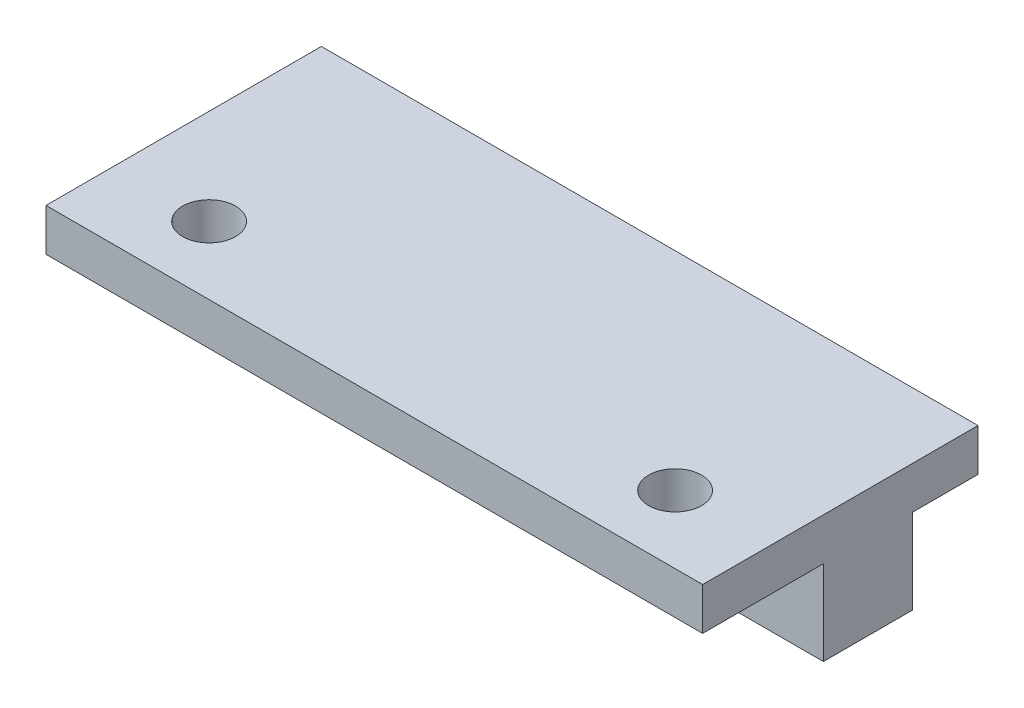
ISO-10303-21;
HEADER;
FILE_DESCRIPTION(('STEP AP214'),'2;1');
FILE_NAME('part.step','',(''),(''),'','','');
FILE_SCHEMA(('AUTOMOTIVE_DESIGN { 1 0 10303 214 1 1 1 1 }'));
ENDSEC;
DATA;
#1=APPLICATION_CONTEXT('core data for automotive mechanical design processes');
#2=APPLICATION_PROTOCOL_DEFINITION('international standard','automotive_design',2000,#1);
#3=PRODUCT_CONTEXT('',#1,'mechanical');
#4=PRODUCT('Part','Part','',(#3));
#5=PRODUCT_RELATED_PRODUCT_CATEGORY('part','',(#4));
#6=PRODUCT_DEFINITION_FORMATION('','',#4);
#7=PRODUCT_DEFINITION_CONTEXT('part definition',#1,'design');
#8=PRODUCT_DEFINITION('design','',#6,#7);
#9=PRODUCT_DEFINITION_SHAPE('','',#8);
#10=(LENGTH_UNIT() NAMED_UNIT(*) SI_UNIT(.MILLI.,.METRE.));
#11=(NAMED_UNIT(*) PLANE_ANGLE_UNIT() SI_UNIT($,.RADIAN.));
#12=(NAMED_UNIT(*) SI_UNIT($,.STERADIAN.) SOLID_ANGLE_UNIT());
#13=UNCERTAINTY_MEASURE_WITH_UNIT(LENGTH_MEASURE(1.E-05),#10,'distance_accuracy_value','');
#14=(GEOMETRIC_REPRESENTATION_CONTEXT(3) GLOBAL_UNCERTAINTY_ASSIGNED_CONTEXT((#13)) GLOBAL_UNIT_ASSIGNED_CONTEXT((#10,
#11,#12)) REPRESENTATION_CONTEXT('',''));
#15=CARTESIAN_POINT('',(0.,0.,0.));
#16=DIRECTION('',(0.,0.,1.));
#17=DIRECTION('',(1.,0.,0.));
#18=AXIS2_PLACEMENT_3D('',#15,#16,#17);
#19=CARTESIAN_POINT('',(0.,0.,0.));
#20=DIRECTION('',(0.,-1.,0.));
#21=DIRECTION('',(0.,0.,-1.));
#22=AXIS2_PLACEMENT_3D('',#19,#20,#21);
#23=PLANE('',#22);
#24=DIRECTION('',(-1.,0.,0.));
#25=VECTOR('',#24,1.);
#26=CARTESIAN_POINT('',(0.,0.,-5.7));
#27=LINE('',#26,#25);
#28=CARTESIAN_POINT('',(31.,0.,-5.7));
#29=VERTEX_POINT('',#28);
#30=CARTESIAN_POINT('',(0.,0.,-5.7));
#31=VERTEX_POINT('',#30);
#32=EDGE_CURVE('E61',#29,#31,#27,.T.);
#33=ORIENTED_EDGE('',*,*,#32,.F.);
#34=DIRECTION('',(0.,0.,-1.));
#35=VECTOR('',#34,1.);
#36=CARTESIAN_POINT('',(31.,0.,0.));
#37=LINE('',#36,#35);
#38=CARTESIAN_POINT('',(31.,0.,0.));
#39=VERTEX_POINT('',#38);
#40=EDGE_CURVE('E223',#39,#29,#37,.T.);
#41=ORIENTED_EDGE('',*,*,#40,.F.);
#42=DIRECTION('',(1.,0.,0.));
#43=VECTOR('',#42,1.);
#44=CARTESIAN_POINT('',(0.,0.,0.));
#45=LINE('',#44,#43);
#46=CARTESIAN_POINT('',(0.,0.,0.));
#47=VERTEX_POINT('',#46);
#48=EDGE_CURVE('E220',#47,#39,#45,.T.);
#49=ORIENTED_EDGE('',*,*,#48,.F.);
#50=DIRECTION('',(0.,0.,1.));
#51=VECTOR('',#50,1.);
#52=CARTESIAN_POINT('',(0.,0.,0.));
#53=LINE('',#52,#51);
#54=EDGE_CURVE('E203',#31,#47,#53,.T.);
#55=ORIENTED_EDGE('',*,*,#54,.F.);
#56=EDGE_LOOP('',(#33,#41,#49,#55));
#57=FACE_BOUND('',#56,.T.);
#58=CARTESIAN_POINT('',(4.5,0.,-3.2));
#59=DIRECTION('',(0.,1.,0.));
#60=DIRECTION('',(0.,0.,1.));
#61=AXIS2_PLACEMENT_3D('',#58,#59,#60);
#62=CIRCLE('',#61,1.25);
#63=CARTESIAN_POINT('',(4.5,0.,-1.95));
#64=VERTEX_POINT('',#63);
#65=EDGE_CURVE('E197',#64,#64,#62,.T.);
#66=ORIENTED_EDGE('',*,*,#65,.T.);
#67=EDGE_LOOP('',(#66));
#68=FACE_BOUND('',#67,.T.);
#69=CARTESIAN_POINT('',(26.5,0.,-3.2));
#70=DIRECTION('',(0.,1.,0.));
#71=DIRECTION('',(0.,0.,-1.));
#72=AXIS2_PLACEMENT_3D('',#69,#70,#71);
#73=CIRCLE('',#72,1.25);
#74=CARTESIAN_POINT('',(26.5,0.,-4.45));
#75=VERTEX_POINT('',#74);
#76=EDGE_CURVE('E193',#75,#75,#73,.T.);
#77=ORIENTED_EDGE('',*,*,#76,.T.);
#78=EDGE_LOOP('',(#77));
#79=FACE_BOUND('',#78,.T.);
#80=ADVANCED_FACE('F38',(#57,#68,#79),#23,.T.);
#81=CARTESIAN_POINT('',(0.,2.,0.));
#82=DIRECTION('',(0.,-1.,0.));
#83=DIRECTION('',(0.,0.,-1.));
#84=AXIS2_PLACEMENT_3D('',#81,#82,#83);
#85=PLANE('',#84);
#86=DIRECTION('',(0.,0.,1.));
#87=VECTOR('',#86,1.);
#88=CARTESIAN_POINT('',(0.,2.,0.));
#89=LINE('',#88,#87);
#90=CARTESIAN_POINT('',(0.,2.,-13.));
#91=VERTEX_POINT('',#90);
#92=CARTESIAN_POINT('',(0.,2.,0.));
#93=VERTEX_POINT('',#92);
#94=EDGE_CURVE('E206',#91,#93,#89,.T.);
#95=ORIENTED_EDGE('',*,*,#94,.T.);
#96=DIRECTION('',(1.,0.,0.));
#97=VECTOR('',#96,1.);
#98=CARTESIAN_POINT('',(0.,2.,0.));
#99=LINE('',#98,#97);
#100=CARTESIAN_POINT('',(31.,2.,0.));
#101=VERTEX_POINT('',#100);
#102=EDGE_CURVE('E209',#93,#101,#99,.T.);
#103=ORIENTED_EDGE('',*,*,#102,.T.);
#104=DIRECTION('',(0.,0.,-1.));
#105=VECTOR('',#104,1.);
#106=CARTESIAN_POINT('',(31.,2.,0.));
#107=LINE('',#106,#105);
#108=CARTESIAN_POINT('',(31.,2.,-13.));
#109=VERTEX_POINT('',#108);
#110=EDGE_CURVE('E212',#101,#109,#107,.T.);
#111=ORIENTED_EDGE('',*,*,#110,.T.);
#112=DIRECTION('',(-1.,0.,0.));
#113=VECTOR('',#112,1.);
#114=CARTESIAN_POINT('',(0.,2.,-13.));
#115=LINE('',#114,#113);
#116=EDGE_CURVE('E214',#109,#91,#115,.T.);
#117=ORIENTED_EDGE('',*,*,#116,.T.);
#118=EDGE_LOOP('',(#95,#103,#111,#117));
#119=FACE_BOUND('',#118,.T.);
#120=CARTESIAN_POINT('',(4.5,2.,-3.2));
#121=DIRECTION('',(0.,1.,0.));
#122=DIRECTION('',(0.,0.,1.));
#123=AXIS2_PLACEMENT_3D('',#120,#121,#122);
#124=CIRCLE('',#123,1.25);
#125=CARTESIAN_POINT('',(4.5,2.,-1.95));
#126=VERTEX_POINT('',#125);
#127=EDGE_CURVE('E200',#126,#126,#124,.T.);
#128=ORIENTED_EDGE('',*,*,#127,.F.);
#129=EDGE_LOOP('',(#128));
#130=FACE_BOUND('',#129,.T.);
#131=CARTESIAN_POINT('',(26.5,2.,-3.2));
#132=DIRECTION('',(0.,1.,0.));
#133=DIRECTION('',(0.,0.,-1.));
#134=AXIS2_PLACEMENT_3D('',#131,#132,#133);
#135=CIRCLE('',#134,1.25);
#136=CARTESIAN_POINT('',(26.5,2.,-4.45));
#137=VERTEX_POINT('',#136);
#138=EDGE_CURVE('E194',#137,#137,#135,.T.);
#139=ORIENTED_EDGE('',*,*,#138,.F.);
#140=EDGE_LOOP('',(#139));
#141=FACE_BOUND('',#140,.T.);
#142=ADVANCED_FACE('F264',(#119,#130,#141),#85,.F.);
#143=DIRECTION('',(1.,0.,0.));
#144=VECTOR('',#143,1.);
#145=CARTESIAN_POINT('',(0.,0.,-9.9));
#146=LINE('',#145,#144);
#147=CARTESIAN_POINT('',(0.,0.,-9.9));
#148=VERTEX_POINT('',#147);
#149=CARTESIAN_POINT('',(31.,0.,-9.9));
#150=VERTEX_POINT('',#149);
#151=EDGE_CURVE('E145',#148,#150,#146,.T.);
#152=ORIENTED_EDGE('',*,*,#151,.F.);
#153=CARTESIAN_POINT('',(0.,0.,-13.));
#154=VERTEX_POINT('',#153);
#155=EDGE_CURVE('E217',#154,#148,#53,.T.);
#156=ORIENTED_EDGE('',*,*,#155,.F.);
#157=DIRECTION('',(-1.,0.,0.));
#158=VECTOR('',#157,1.);
#159=CARTESIAN_POINT('',(0.,0.,-13.));
#160=LINE('',#159,#158);
#161=CARTESIAN_POINT('',(31.,0.,-13.));
#162=VERTEX_POINT('',#161);
#163=EDGE_CURVE('E210',#162,#154,#160,.T.);
#164=ORIENTED_EDGE('',*,*,#163,.F.);
#165=EDGE_CURVE('E222',#150,#162,#37,.T.);
#166=ORIENTED_EDGE('',*,*,#165,.F.);
#167=EDGE_LOOP('',(#152,#156,#164,#166));
#168=FACE_BOUND('',#167,.T.);
#169=ADVANCED_FACE('F257',(#168),#23,.T.);
#170=CARTESIAN_POINT('',(0.,2.,0.));
#171=DIRECTION('',(1.,0.,0.));
#172=DIRECTION('',(0.,0.,-1.));
#173=AXIS2_PLACEMENT_3D('',#170,#171,#172);
#174=PLANE('',#173);
#175=ORIENTED_EDGE('',*,*,#155,.T.);
#176=DIRECTION('',(0.,1.,0.));
#177=VECTOR('',#176,1.);
#178=CARTESIAN_POINT('',(0.,-4.,-9.9));
#179=LINE('',#178,#177);
#180=CARTESIAN_POINT('',(0.,-4.,-9.9));
#181=VERTEX_POINT('',#180);
#182=EDGE_CURVE('E190',#181,#148,#179,.T.);
#183=ORIENTED_EDGE('',*,*,#182,.F.);
#184=DIRECTION('',(0.,0.,-1.));
#185=VECTOR('',#184,1.);
#186=CARTESIAN_POINT('',(0.,-4.,-5.7));
#187=LINE('',#186,#185);
#188=CARTESIAN_POINT('',(0.,-4.,-5.7));
#189=VERTEX_POINT('',#188);
#190=EDGE_CURVE('E169',#189,#181,#187,.T.);
#191=ORIENTED_EDGE('',*,*,#190,.F.);
#192=DIRECTION('',(0.,1.,0.));
#193=VECTOR('',#192,1.);
#194=CARTESIAN_POINT('',(0.,-4.,-5.7));
#195=LINE('',#194,#193);
#196=EDGE_CURVE('E178',#189,#31,#195,.T.);
#197=ORIENTED_EDGE('',*,*,#196,.T.);
#198=ORIENTED_EDGE('',*,*,#54,.T.);
#199=DIRECTION('',(0.,-1.,0.));
#200=VECTOR('',#199,1.);
#201=CARTESIAN_POINT('',(0.,2.,0.));
#202=LINE('',#201,#200);
#203=EDGE_CURVE('E11',#93,#47,#202,.T.);
#204=ORIENTED_EDGE('',*,*,#203,.F.);
#205=ORIENTED_EDGE('',*,*,#94,.F.);
#206=DIRECTION('',(0.,-1.,0.));
#207=VECTOR('',#206,1.);
#208=CARTESIAN_POINT('',(0.,2.,-13.));
#209=LINE('',#208,#207);
#210=EDGE_CURVE('E216',#91,#154,#209,.T.);
#211=ORIENTED_EDGE('',*,*,#210,.T.);
#212=EDGE_LOOP('',(#175,#183,#191,#197,#198,#204,#205,#211));
#213=FACE_BOUND('',#212,.T.);
#214=ADVANCED_FACE('F40',(#213),#174,.F.);
#215=CARTESIAN_POINT('',(0.,2.,0.));
#216=DIRECTION('',(0.,0.,-1.));
#217=DIRECTION('',(-1.,0.,0.));
#218=AXIS2_PLACEMENT_3D('',#215,#216,#217);
#219=PLANE('',#218);
#220=ORIENTED_EDGE('',*,*,#48,.T.);
#221=DIRECTION('',(0.,-1.,0.));
#222=VECTOR('',#221,1.);
#223=CARTESIAN_POINT('',(31.,2.,0.));
#224=LINE('',#223,#222);
#225=EDGE_CURVE('E46',#101,#39,#224,.T.);
#226=ORIENTED_EDGE('',*,*,#225,.F.);
#227=ORIENTED_EDGE('',*,*,#102,.F.);
#228=ORIENTED_EDGE('',*,*,#203,.T.);
#229=EDGE_LOOP('',(#220,#226,#227,#228));
#230=FACE_BOUND('',#229,.T.);
#231=ADVANCED_FACE('F241',(#230),#219,.F.);
#232=CARTESIAN_POINT('',(31.,2.,0.));
#233=DIRECTION('',(-1.,0.,0.));
#234=DIRECTION('',(0.,0.,1.));
#235=AXIS2_PLACEMENT_3D('',#232,#233,#234);
#236=PLANE('',#235);
#237=ORIENTED_EDGE('',*,*,#40,.T.);
#238=DIRECTION('',(0.,1.,0.));
#239=VECTOR('',#238,1.);
#240=CARTESIAN_POINT('',(31.,-4.,-5.7));
#241=LINE('',#240,#239);
#242=CARTESIAN_POINT('',(31.,-4.,-5.7));
#243=VERTEX_POINT('',#242);
#244=EDGE_CURVE('E184',#243,#29,#241,.T.);
#245=ORIENTED_EDGE('',*,*,#244,.F.);
#246=DIRECTION('',(0.,0.,1.));
#247=VECTOR('',#246,1.);
#248=CARTESIAN_POINT('',(31.,-4.,-5.7));
#249=LINE('',#248,#247);
#250=CARTESIAN_POINT('',(31.,-4.,-9.9));
#251=VERTEX_POINT('',#250);
#252=EDGE_CURVE('E174',#251,#243,#249,.T.);
#253=ORIENTED_EDGE('',*,*,#252,.F.);
#254=DIRECTION('',(0.,1.,0.));
#255=VECTOR('',#254,1.);
#256=CARTESIAN_POINT('',(31.,-4.,-9.9));
#257=LINE('',#256,#255);
#258=EDGE_CURVE('E187',#251,#150,#257,.T.);
#259=ORIENTED_EDGE('',*,*,#258,.T.);
#260=ORIENTED_EDGE('',*,*,#165,.T.);
#261=DIRECTION('',(0.,-1.,0.));
#262=VECTOR('',#261,1.);
#263=CARTESIAN_POINT('',(31.,2.,-13.));
#264=LINE('',#263,#262);
#265=EDGE_CURVE('E228',#109,#162,#264,.T.);
#266=ORIENTED_EDGE('',*,*,#265,.F.);
#267=ORIENTED_EDGE('',*,*,#110,.F.);
#268=ORIENTED_EDGE('',*,*,#225,.T.);
#269=EDGE_LOOP('',(#237,#245,#253,#259,#260,#266,#267,#268));
#270=FACE_BOUND('',#269,.T.);
#271=ADVANCED_FACE('F234',(#270),#236,.F.);
#272=CARTESIAN_POINT('',(0.,2.,-13.));
#273=DIRECTION('',(0.,0.,1.));
#274=DIRECTION('',(1.,0.,0.));
#275=AXIS2_PLACEMENT_3D('',#272,#273,#274);
#276=PLANE('',#275);
#277=ORIENTED_EDGE('',*,*,#163,.T.);
#278=ORIENTED_EDGE('',*,*,#210,.F.);
#279=ORIENTED_EDGE('',*,*,#116,.F.);
#280=ORIENTED_EDGE('',*,*,#265,.T.);
#281=EDGE_LOOP('',(#277,#278,#279,#280));
#282=FACE_BOUND('',#281,.T.);
#283=ADVANCED_FACE('F262',(#282),#276,.F.);
#284=CARTESIAN_POINT('',(4.5,2.,-3.2));
#285=DIRECTION('',(0.,-1.,0.));
#286=DIRECTION('',(0.,0.,-1.));
#287=AXIS2_PLACEMENT_3D('',#284,#285,#286);
#288=CYLINDRICAL_SURFACE('',#287,1.25);
#289=ORIENTED_EDGE('',*,*,#127,.T.);
#290=EDGE_LOOP('',(#289));
#291=FACE_BOUND('',#290,.T.);
#292=ORIENTED_EDGE('',*,*,#65,.F.);
#293=EDGE_LOOP('',(#292));
#294=FACE_BOUND('',#293,.T.);
#295=ADVANCED_FACE('F275',(#291,#294),#288,.F.);
#296=CARTESIAN_POINT('',(26.5,2.,-3.2));
#297=DIRECTION('',(0.,-1.,0.));
#298=DIRECTION('',(0.,0.,-1.));
#299=AXIS2_PLACEMENT_3D('',#296,#297,#298);
#300=CYLINDRICAL_SURFACE('',#299,1.25);
#301=ORIENTED_EDGE('',*,*,#138,.T.);
#302=EDGE_LOOP('',(#301));
#303=FACE_BOUND('',#302,.T.);
#304=ORIENTED_EDGE('',*,*,#76,.F.);
#305=EDGE_LOOP('',(#304));
#306=FACE_BOUND('',#305,.T.);
#307=ADVANCED_FACE('F272',(#303,#306),#300,.F.);
#308=CARTESIAN_POINT('',(0.,-4.,0.));
#309=DIRECTION('',(0.,-1.,0.));
#310=DIRECTION('',(0.,0.,-1.));
#311=AXIS2_PLACEMENT_3D('',#308,#309,#310);
#312=PLANE('',#311);
#313=ORIENTED_EDGE('',*,*,#190,.T.);
#314=DIRECTION('',(1.,0.,0.));
#315=VECTOR('',#314,1.);
#316=CARTESIAN_POINT('',(0.,-4.,-9.9));
#317=LINE('',#316,#315);
#318=EDGE_CURVE('E172',#181,#251,#317,.T.);
#319=ORIENTED_EDGE('',*,*,#318,.T.);
#320=ORIENTED_EDGE('',*,*,#252,.T.);
#321=DIRECTION('',(-1.,0.,0.));
#322=VECTOR('',#321,1.);
#323=CARTESIAN_POINT('',(0.,-4.,-5.7));
#324=LINE('',#323,#322);
#325=EDGE_CURVE('E176',#243,#189,#324,.T.);
#326=ORIENTED_EDGE('',*,*,#325,.T.);
#327=EDGE_LOOP('',(#313,#319,#320,#326));
#328=FACE_BOUND('',#327,.T.);
#329=DIRECTION('',(1.,0.,0.));
#330=VECTOR('',#329,1.);
#331=CARTESIAN_POINT('',(1.7,-4.,-8.9));
#332=LINE('',#331,#330);
#333=CARTESIAN_POINT('',(1.7,-4.,-8.9));
#334=VERTEX_POINT('',#333);
#335=CARTESIAN_POINT('',(29.3,-4.,-8.9));
#336=VERTEX_POINT('',#335);
#337=EDGE_CURVE('E137',#334,#336,#332,.T.);
#338=ORIENTED_EDGE('',*,*,#337,.F.);
#339=DIRECTION('',(0.,0.,-1.));
#340=VECTOR('',#339,1.);
#341=CARTESIAN_POINT('',(1.7,-4.,-6.7));
#342=LINE('',#341,#340);
#343=CARTESIAN_POINT('',(1.7,-4.,-6.7));
#344=VERTEX_POINT('',#343);
#345=EDGE_CURVE('E129',#344,#334,#342,.T.);
#346=ORIENTED_EDGE('',*,*,#345,.F.);
#347=DIRECTION('',(-1.,0.,0.));
#348=VECTOR('',#347,1.);
#349=CARTESIAN_POINT('',(1.7,-4.,-6.7));
#350=LINE('',#349,#348);
#351=CARTESIAN_POINT('',(29.3,-4.,-6.7));
#352=VERTEX_POINT('',#351);
#353=EDGE_CURVE('E153',#352,#344,#350,.T.);
#354=ORIENTED_EDGE('',*,*,#353,.F.);
#355=DIRECTION('',(0.,0.,1.));
#356=VECTOR('',#355,1.);
#357=CARTESIAN_POINT('',(29.3,-4.,-6.7));
#358=LINE('',#357,#356);
#359=EDGE_CURVE('E151',#336,#352,#358,.T.);
#360=ORIENTED_EDGE('',*,*,#359,.F.);
#361=EDGE_LOOP('',(#338,#346,#354,#360));
#362=FACE_BOUND('',#361,.T.);
#363=ADVANCED_FACE('F149',(#328,#362),#312,.T.);
#364=CARTESIAN_POINT('',(0.,-4.,-9.9));
#365=DIRECTION('',(0.,0.,1.));
#366=DIRECTION('',(1.,0.,0.));
#367=AXIS2_PLACEMENT_3D('',#364,#365,#366);
#368=PLANE('',#367);
#369=ORIENTED_EDGE('',*,*,#151,.T.);
#370=ORIENTED_EDGE('',*,*,#258,.F.);
#371=ORIENTED_EDGE('',*,*,#318,.F.);
#372=ORIENTED_EDGE('',*,*,#182,.T.);
#373=EDGE_LOOP('',(#369,#370,#371,#372));
#374=FACE_BOUND('',#373,.T.);
#375=ADVANCED_FACE('F254',(#374),#368,.F.);
#376=CARTESIAN_POINT('',(0.,-4.,-5.7));
#377=DIRECTION('',(0.,0.,-1.));
#378=DIRECTION('',(-1.,0.,0.));
#379=AXIS2_PLACEMENT_3D('',#376,#377,#378);
#380=PLANE('',#379);
#381=ORIENTED_EDGE('',*,*,#32,.T.);
#382=ORIENTED_EDGE('',*,*,#196,.F.);
#383=ORIENTED_EDGE('',*,*,#325,.F.);
#384=ORIENTED_EDGE('',*,*,#244,.T.);
#385=EDGE_LOOP('',(#381,#382,#383,#384));
#386=FACE_BOUND('',#385,.T.);
#387=ADVANCED_FACE('F249',(#386),#380,.F.);
#388=CARTESIAN_POINT('',(1.7,-4.,-6.7));
#389=DIRECTION('',(1.,0.,0.));
#390=DIRECTION('',(0.,0.,-1.));
#391=AXIS2_PLACEMENT_3D('',#388,#389,#390);
#392=PLANE('',#391);
#393=DIRECTION('',(0.,0.,-1.));
#394=VECTOR('',#393,1.);
#395=CARTESIAN_POINT('',(1.7,0.,-6.7));
#396=LINE('',#395,#394);
#397=CARTESIAN_POINT('',(1.7,0.,-6.7));
#398=VERTEX_POINT('',#397);
#399=CARTESIAN_POINT('',(1.7,0.,-8.9));
#400=VERTEX_POINT('',#399);
#401=EDGE_CURVE('E157',#398,#400,#396,.T.);
#402=ORIENTED_EDGE('',*,*,#401,.F.);
#403=DIRECTION('',(0.,1.,0.));
#404=VECTOR('',#403,1.);
#405=CARTESIAN_POINT('',(1.7,-4.,-6.7));
#406=LINE('',#405,#404);
#407=EDGE_CURVE('E53',#344,#398,#406,.T.);
#408=ORIENTED_EDGE('',*,*,#407,.F.);
#409=ORIENTED_EDGE('',*,*,#345,.T.);
#410=DIRECTION('',(0.,1.,0.));
#411=VECTOR('',#410,1.);
#412=CARTESIAN_POINT('',(1.7,-4.,-8.9));
#413=LINE('',#412,#411);
#414=EDGE_CURVE('E132',#334,#400,#413,.T.);
#415=ORIENTED_EDGE('',*,*,#414,.T.);
#416=EDGE_LOOP('',(#402,#408,#409,#415));
#417=FACE_BOUND('',#416,.T.);
#418=ADVANCED_FACE('F131',(#417),#392,.T.);
#419=CARTESIAN_POINT('',(1.7,-4.,-8.9));
#420=DIRECTION('',(0.,0.,1.));
#421=DIRECTION('',(1.,0.,0.));
#422=AXIS2_PLACEMENT_3D('',#419,#420,#421);
#423=PLANE('',#422);
#424=DIRECTION('',(1.,0.,0.));
#425=VECTOR('',#424,1.);
#426=CARTESIAN_POINT('',(1.7,0.,-8.9));
#427=LINE('',#426,#425);
#428=CARTESIAN_POINT('',(29.3,0.,-8.9));
#429=VERTEX_POINT('',#428);
#430=EDGE_CURVE('E144',#400,#429,#427,.T.);
#431=ORIENTED_EDGE('',*,*,#430,.F.);
#432=ORIENTED_EDGE('',*,*,#414,.F.);
#433=ORIENTED_EDGE('',*,*,#337,.T.);
#434=DIRECTION('',(0.,1.,0.));
#435=VECTOR('',#434,1.);
#436=CARTESIAN_POINT('',(29.3,-4.,-8.9));
#437=LINE('',#436,#435);
#438=EDGE_CURVE('E146',#336,#429,#437,.T.);
#439=ORIENTED_EDGE('',*,*,#438,.T.);
#440=EDGE_LOOP('',(#431,#432,#433,#439));
#441=FACE_BOUND('',#440,.T.);
#442=ADVANCED_FACE('F141',(#441),#423,.T.);
#443=CARTESIAN_POINT('',(29.3,-4.,-6.7));
#444=DIRECTION('',(-1.,0.,0.));
#445=DIRECTION('',(0.,0.,1.));
#446=AXIS2_PLACEMENT_3D('',#443,#444,#445);
#447=PLANE('',#446);
#448=DIRECTION('',(0.,0.,1.));
#449=VECTOR('',#448,1.);
#450=CARTESIAN_POINT('',(29.3,0.,-6.7));
#451=LINE('',#450,#449);
#452=CARTESIAN_POINT('',(29.3,0.,-6.7));
#453=VERTEX_POINT('',#452);
#454=EDGE_CURVE('E160',#429,#453,#451,.T.);
#455=ORIENTED_EDGE('',*,*,#454,.F.);
#456=ORIENTED_EDGE('',*,*,#438,.F.);
#457=ORIENTED_EDGE('',*,*,#359,.T.);
#458=DIRECTION('',(0.,1.,0.));
#459=VECTOR('',#458,1.);
#460=CARTESIAN_POINT('',(29.3,-4.,-6.7));
#461=LINE('',#460,#459);
#462=EDGE_CURVE('E166',#352,#453,#461,.T.);
#463=ORIENTED_EDGE('',*,*,#462,.T.);
#464=EDGE_LOOP('',(#455,#456,#457,#463));
#465=FACE_BOUND('',#464,.T.);
#466=ADVANCED_FACE('F319',(#465),#447,.T.);
#467=CARTESIAN_POINT('',(1.7,-4.,-6.7));
#468=DIRECTION('',(0.,0.,-1.));
#469=DIRECTION('',(-1.,0.,0.));
#470=AXIS2_PLACEMENT_3D('',#467,#468,#469);
#471=PLANE('',#470);
#472=DIRECTION('',(-1.,0.,0.));
#473=VECTOR('',#472,1.);
#474=CARTESIAN_POINT('',(1.7,0.,-6.7));
#475=LINE('',#474,#473);
#476=EDGE_CURVE('E138',#453,#398,#475,.T.);
#477=ORIENTED_EDGE('',*,*,#476,.F.);
#478=ORIENTED_EDGE('',*,*,#462,.F.);
#479=ORIENTED_EDGE('',*,*,#353,.T.);
#480=ORIENTED_EDGE('',*,*,#407,.T.);
#481=EDGE_LOOP('',(#477,#478,#479,#480));
#482=FACE_BOUND('',#481,.T.);
#483=ADVANCED_FACE('F286',(#482),#471,.T.);
#484=ORIENTED_EDGE('',*,*,#476,.T.);
#485=ORIENTED_EDGE('',*,*,#401,.T.);
#486=ORIENTED_EDGE('',*,*,#430,.T.);
#487=ORIENTED_EDGE('',*,*,#454,.T.);
#488=EDGE_LOOP('',(#484,#485,#486,#487));
#489=FACE_BOUND('',#488,.T.);
#490=ADVANCED_FACE('F281',(#489),#23,.T.);
#491=CLOSED_SHELL('',(#80,#142,#169,#214,#231,#271,#283,#295,#307,#363,#375,#387,#418,#442,#466,
#483,#490));
#492=MANIFOLD_SOLID_BREP('B2',#491);
#493=ADVANCED_BREP_SHAPE_REPRESENTATION('',(#18,#492),#14);
#494=SHAPE_DEFINITION_REPRESENTATION(#9,#493);
ENDSEC;
END-ISO-10303-21;
